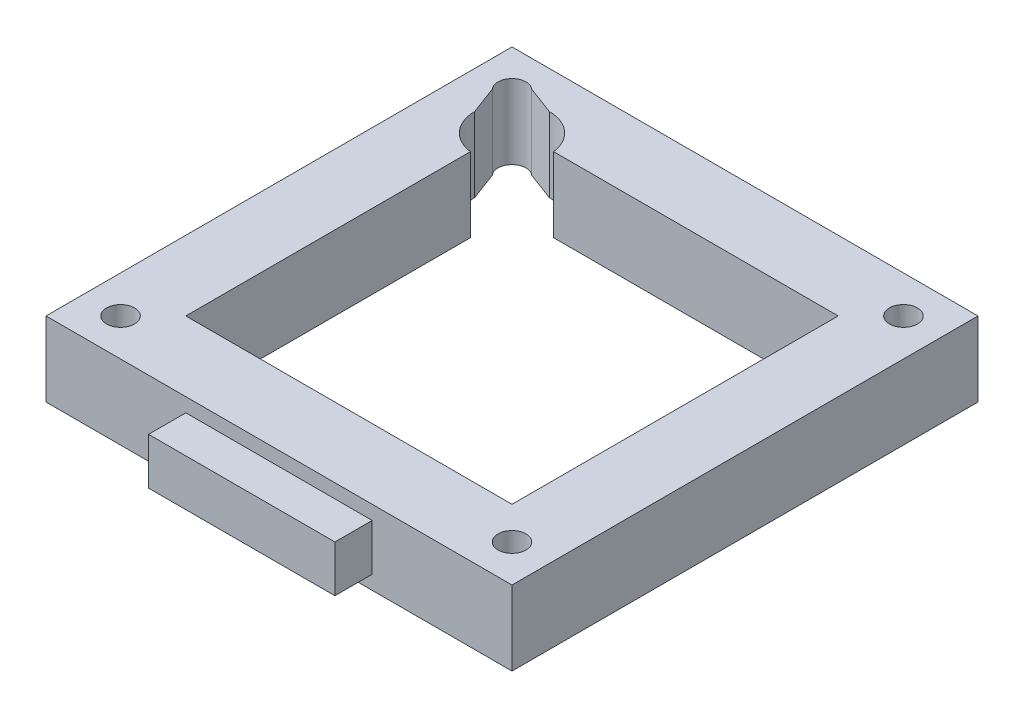
ISO-10303-21;
HEADER;
FILE_DESCRIPTION(('STEP AP214'),'2;1');
FILE_NAME('part.step','',(''),(''),'','','');
FILE_SCHEMA(('AUTOMOTIVE_DESIGN { 1 0 10303 214 1 1 1 1 }'));
ENDSEC;
DATA;
#1=APPLICATION_CONTEXT('core data for automotive mechanical design processes');
#2=APPLICATION_PROTOCOL_DEFINITION('international standard','automotive_design',2000,#1);
#3=PRODUCT_CONTEXT('',#1,'mechanical');
#4=PRODUCT('Part','Part','',(#3));
#5=PRODUCT_RELATED_PRODUCT_CATEGORY('part','',(#4));
#6=PRODUCT_DEFINITION_FORMATION('','',#4);
#7=PRODUCT_DEFINITION_CONTEXT('part definition',#1,'design');
#8=PRODUCT_DEFINITION('design','',#6,#7);
#9=PRODUCT_DEFINITION_SHAPE('','',#8);
#10=(LENGTH_UNIT() NAMED_UNIT(*) SI_UNIT(.MILLI.,.METRE.));
#11=(NAMED_UNIT(*) PLANE_ANGLE_UNIT() SI_UNIT($,.RADIAN.));
#12=(NAMED_UNIT(*) SI_UNIT($,.STERADIAN.) SOLID_ANGLE_UNIT());
#13=UNCERTAINTY_MEASURE_WITH_UNIT(LENGTH_MEASURE(1.E-05),#10,'distance_accuracy_value','');
#14=(GEOMETRIC_REPRESENTATION_CONTEXT(3) GLOBAL_UNCERTAINTY_ASSIGNED_CONTEXT((#13)) GLOBAL_UNIT_ASSIGNED_CONTEXT((#10,
#11,#12)) REPRESENTATION_CONTEXT('',''));
#15=CARTESIAN_POINT('',(0.,0.,0.));
#16=DIRECTION('',(0.,0.,1.));
#17=DIRECTION('',(1.,0.,0.));
#18=AXIS2_PLACEMENT_3D('',#15,#16,#17);
#19=CARTESIAN_POINT('',(0.,8.,25.));
#20=DIRECTION('',(0.,0.,-1.));
#21=DIRECTION('',(-1.,0.,0.));
#22=AXIS2_PLACEMENT_3D('',#19,#20,#21);
#23=PLANE('',#22);
#24=DIRECTION('',(1.,0.,0.));
#25=VECTOR('',#24,1.);
#26=CARTESIAN_POINT('',(0.,0.,25.));
#27=LINE('',#26,#25);
#28=CARTESIAN_POINT('',(-25.,0.,25.));
#29=VERTEX_POINT('',#28);
#30=CARTESIAN_POINT('',(25.,0.,25.));
#31=VERTEX_POINT('',#30);
#32=EDGE_CURVE('E452',#29,#31,#27,.T.);
#33=ORIENTED_EDGE('',*,*,#32,.T.);
#34=DIRECTION('',(0.,-1.,0.));
#35=VECTOR('',#34,1.);
#36=CARTESIAN_POINT('',(25.,8.,25.));
#37=LINE('',#36,#35);
#38=CARTESIAN_POINT('',(25.,8.,25.));
#39=VERTEX_POINT('',#38);
#40=EDGE_CURVE('E11',#39,#31,#37,.T.);
#41=ORIENTED_EDGE('',*,*,#40,.F.);
#42=DIRECTION('',(1.,0.,0.));
#43=VECTOR('',#42,1.);
#44=CARTESIAN_POINT('',(0.,8.,25.));
#45=LINE('',#44,#43);
#46=CARTESIAN_POINT('',(-25.,8.,25.));
#47=VERTEX_POINT('',#46);
#48=EDGE_CURVE('E392',#47,#39,#45,.T.);
#49=ORIENTED_EDGE('',*,*,#48,.F.);
#50=DIRECTION('',(0.,-1.,0.));
#51=VECTOR('',#50,1.);
#52=CARTESIAN_POINT('',(-25.,8.,25.));
#53=LINE('',#52,#51);
#54=EDGE_CURVE('E475',#47,#29,#53,.T.);
#55=ORIENTED_EDGE('',*,*,#54,.T.);
#56=EDGE_LOOP('',(#33,#41,#49,#55));
#57=FACE_BOUND('',#56,.T.);
#58=DIRECTION('',(1.,0.,0.));
#59=VECTOR('',#58,1.);
#60=CARTESIAN_POINT('',(0.,1.5000000000053,25.));
#61=LINE('',#60,#59);
#62=CARTESIAN_POINT('',(-10.0000000000553,1.5000000000053,25.));
#63=VERTEX_POINT('',#62);
#64=CARTESIAN_POINT('',(9.9999999999447,1.5000000000053,25.));
#65=VERTEX_POINT('',#64);
#66=EDGE_CURVE('E75',#63,#65,#61,.T.);
#67=ORIENTED_EDGE('',*,*,#66,.F.);
#68=DIRECTION('',(0.,-1.,0.));
#69=VECTOR('',#68,1.);
#70=CARTESIAN_POINT('',(-10.0000000000553,8.,25.));
#71=LINE('',#70,#69);
#72=CARTESIAN_POINT('',(-10.0000000000553,6.5000000000053,25.));
#73=VERTEX_POINT('',#72);
#74=EDGE_CURVE('E274',#73,#63,#71,.T.);
#75=ORIENTED_EDGE('',*,*,#74,.F.);
#76=DIRECTION('',(-1.,0.,0.));
#77=VECTOR('',#76,1.);
#78=CARTESIAN_POINT('',(0.,6.5000000000053,25.));
#79=LINE('',#78,#77);
#80=CARTESIAN_POINT('',(9.9999999999447,6.5000000000053,25.));
#81=VERTEX_POINT('',#80);
#82=EDGE_CURVE('E290',#81,#73,#79,.T.);
#83=ORIENTED_EDGE('',*,*,#82,.F.);
#84=DIRECTION('',(0.,1.,0.));
#85=VECTOR('',#84,1.);
#86=CARTESIAN_POINT('',(9.9999999999447,8.,25.));
#87=LINE('',#86,#85);
#88=EDGE_CURVE('E286',#65,#81,#87,.T.);
#89=ORIENTED_EDGE('',*,*,#88,.F.);
#90=EDGE_LOOP('',(#67,#75,#83,#89));
#91=FACE_BOUND('',#90,.T.);
#92=ADVANCED_FACE('F49',(#57,#91),#23,.F.);
#93=CARTESIAN_POINT('',(25.,8.,0.));
#94=DIRECTION('',(-1.,0.,0.));
#95=DIRECTION('',(0.,0.,1.));
#96=AXIS2_PLACEMENT_3D('',#93,#94,#95);
#97=PLANE('',#96);
#98=DIRECTION('',(0.,0.,-1.));
#99=VECTOR('',#98,1.);
#100=CARTESIAN_POINT('',(25.,0.,0.));
#101=LINE('',#100,#99);
#102=CARTESIAN_POINT('',(25.,0.,-25.));
#103=VERTEX_POINT('',#102);
#104=EDGE_CURVE('E456',#31,#103,#101,.T.);
#105=ORIENTED_EDGE('',*,*,#104,.T.);
#106=DIRECTION('',(0.,-1.,0.));
#107=VECTOR('',#106,1.);
#108=CARTESIAN_POINT('',(25.,8.,-25.));
#109=LINE('',#108,#107);
#110=CARTESIAN_POINT('',(25.,8.,-25.));
#111=VERTEX_POINT('',#110);
#112=EDGE_CURVE('E59',#111,#103,#109,.T.);
#113=ORIENTED_EDGE('',*,*,#112,.F.);
#114=DIRECTION('',(0.,0.,-1.));
#115=VECTOR('',#114,1.);
#116=CARTESIAN_POINT('',(25.,8.,0.));
#117=LINE('',#116,#115);
#118=EDGE_CURVE('E396',#39,#111,#117,.T.);
#119=ORIENTED_EDGE('',*,*,#118,.F.);
#120=ORIENTED_EDGE('',*,*,#40,.T.);
#121=EDGE_LOOP('',(#105,#113,#119,#120));
#122=FACE_BOUND('',#121,.T.);
#123=ADVANCED_FACE('F563',(#122),#97,.F.);
#124=CARTESIAN_POINT('',(0.,8.,-25.));
#125=DIRECTION('',(0.,0.,-1.));
#126=DIRECTION('',(-1.,0.,0.));
#127=AXIS2_PLACEMENT_3D('',#124,#125,#126);
#128=PLANE('',#127);
#129=DIRECTION('',(1.,0.,0.));
#130=VECTOR('',#129,1.);
#131=CARTESIAN_POINT('',(0.,6.5000000000053,-25.));
#132=LINE('',#131,#130);
#133=CARTESIAN_POINT('',(-10.0000000000553,6.5000000000053,-25.));
#134=VERTEX_POINT('',#133);
#135=CARTESIAN_POINT('',(9.9999999999447,6.5000000000053,-25.));
#136=VERTEX_POINT('',#135);
#137=EDGE_CURVE('E311',#134,#136,#132,.T.);
#138=ORIENTED_EDGE('',*,*,#137,.F.);
#139=DIRECTION('',(0.,1.,0.));
#140=VECTOR('',#139,1.);
#141=CARTESIAN_POINT('',(-10.0000000000553,8.,-25.));
#142=LINE('',#141,#140);
#143=CARTESIAN_POINT('',(-10.0000000000553,1.5000000000053,-25.));
#144=VERTEX_POINT('',#143);
#145=EDGE_CURVE('E317',#144,#134,#142,.T.);
#146=ORIENTED_EDGE('',*,*,#145,.F.);
#147=DIRECTION('',(-1.,0.,0.));
#148=VECTOR('',#147,1.);
#149=CARTESIAN_POINT('',(0.,1.5000000000053,-25.));
#150=LINE('',#149,#148);
#151=CARTESIAN_POINT('',(9.9999999999447,1.5000000000053,-25.));
#152=VERTEX_POINT('',#151);
#153=EDGE_CURVE('E336',#152,#144,#150,.T.);
#154=ORIENTED_EDGE('',*,*,#153,.F.);
#155=DIRECTION('',(0.,-1.,0.));
#156=VECTOR('',#155,1.);
#157=CARTESIAN_POINT('',(9.9999999999447,8.,-25.));
#158=LINE('',#157,#156);
#159=EDGE_CURVE('E332',#136,#152,#158,.T.);
#160=ORIENTED_EDGE('',*,*,#159,.F.);
#161=EDGE_LOOP('',(#138,#146,#154,#160));
#162=FACE_BOUND('',#161,.T.);
#163=DIRECTION('',(1.,0.,0.));
#164=VECTOR('',#163,1.);
#165=CARTESIAN_POINT('',(0.,0.,-25.));
#166=LINE('',#165,#164);
#167=CARTESIAN_POINT('',(-25.,0.,-25.));
#168=VERTEX_POINT('',#167);
#169=EDGE_CURVE('E460',#168,#103,#166,.T.);
#170=ORIENTED_EDGE('',*,*,#169,.F.);
#171=DIRECTION('',(0.,-1.,0.));
#172=VECTOR('',#171,1.);
#173=CARTESIAN_POINT('',(-25.,8.,-25.));
#174=LINE('',#173,#172);
#175=CARTESIAN_POINT('',(-25.,8.,-25.));
#176=VERTEX_POINT('',#175);
#177=EDGE_CURVE('E478',#176,#168,#174,.T.);
#178=ORIENTED_EDGE('',*,*,#177,.F.);
#179=DIRECTION('',(1.,0.,0.));
#180=VECTOR('',#179,1.);
#181=CARTESIAN_POINT('',(0.,8.,-25.));
#182=LINE('',#181,#180);
#183=EDGE_CURVE('E399',#176,#111,#182,.T.);
#184=ORIENTED_EDGE('',*,*,#183,.T.);
#185=ORIENTED_EDGE('',*,*,#112,.T.);
#186=EDGE_LOOP('',(#170,#178,#184,#185));
#187=FACE_BOUND('',#186,.T.);
#188=ADVANCED_FACE('F561',(#162,#187),#128,.T.);
#189=CARTESIAN_POINT('',(-17.,8.,-17.));
#190=DIRECTION('',(0.,-1.,0.));
#191=DIRECTION('',(0.,0.,-1.));
#192=AXIS2_PLACEMENT_3D('',#189,#190,#191);
#193=CYLINDRICAL_SURFACE('',#192,4.);
#194=CARTESIAN_POINT('',(-17.,0.,-17.));
#195=DIRECTION('',(0.,1.,0.));
#196=DIRECTION('',(0.,0.,1.));
#197=AXIS2_PLACEMENT_3D('',#194,#195,#196);
#198=CIRCLE('',#197,4.);
#199=CARTESIAN_POINT('',(-13.0313730334031,0.,-17.5));
#200=VERTEX_POINT('',#199);
#201=CARTESIAN_POINT('',(-17.,0.,-21.));
#202=VERTEX_POINT('',#201);
#203=EDGE_CURVE('E346',#200,#202,#198,.T.);
#204=ORIENTED_EDGE('',*,*,#203,.F.);
#205=DIRECTION('',(0.,-1.,0.));
#206=VECTOR('',#205,1.);
#207=CARTESIAN_POINT('',(-13.0313730334031,8.,-17.5));
#208=LINE('',#207,#206);
#209=CARTESIAN_POINT('',(-13.0313730334031,8.,-17.5));
#210=VERTEX_POINT('',#209);
#211=EDGE_CURVE('E53',#210,#200,#208,.T.);
#212=ORIENTED_EDGE('',*,*,#211,.F.);
#213=CARTESIAN_POINT('',(-17.,8.,-17.));
#214=DIRECTION('',(0.,1.,0.));
#215=DIRECTION('',(0.,0.,1.));
#216=AXIS2_PLACEMENT_3D('',#213,#214,#215);
#217=CIRCLE('',#216,4.);
#218=CARTESIAN_POINT('',(-17.,8.,-21.));
#219=VERTEX_POINT('',#218);
#220=EDGE_CURVE('E356',#210,#219,#217,.T.);
#221=ORIENTED_EDGE('',*,*,#220,.T.);
#222=DIRECTION('',(0.,-1.,0.));
#223=VECTOR('',#222,1.);
#224=CARTESIAN_POINT('',(-17.,8.,-21.));
#225=LINE('',#224,#223);
#226=EDGE_CURVE('E415',#219,#202,#225,.T.);
#227=ORIENTED_EDGE('',*,*,#226,.T.);
#228=EDGE_LOOP('',(#204,#212,#221,#227));
#229=FACE_BOUND('',#228,.T.);
#230=ADVANCED_FACE('F513',(#229),#193,.F.);
#231=CARTESIAN_POINT('',(0.,8.,-17.5));
#232=DIRECTION('',(0.,0.,1.));
#233=DIRECTION('',(1.,0.,0.));
#234=AXIS2_PLACEMENT_3D('',#231,#232,#233);
#235=PLANE('',#234);
#236=DIRECTION('',(-1.,0.,0.));
#237=VECTOR('',#236,1.);
#238=CARTESIAN_POINT('',(0.,0.,-17.5));
#239=LINE('',#238,#237);
#240=CARTESIAN_POINT('',(17.5,0.,-17.5));
#241=VERTEX_POINT('',#240);
#242=EDGE_CURVE('E419',#241,#200,#239,.T.);
#243=ORIENTED_EDGE('',*,*,#242,.F.);
#244=DIRECTION('',(0.,-1.,0.));
#245=VECTOR('',#244,1.);
#246=CARTESIAN_POINT('',(17.5,8.,-17.5));
#247=LINE('',#246,#245);
#248=CARTESIAN_POINT('',(17.5,8.,-17.5));
#249=VERTEX_POINT('',#248);
#250=EDGE_CURVE('E502',#249,#241,#247,.T.);
#251=ORIENTED_EDGE('',*,*,#250,.F.);
#252=DIRECTION('',(-1.,0.,0.));
#253=VECTOR('',#252,1.);
#254=CARTESIAN_POINT('',(0.,8.,-17.5));
#255=LINE('',#254,#253);
#256=EDGE_CURVE('E360',#249,#210,#255,.T.);
#257=ORIENTED_EDGE('',*,*,#256,.T.);
#258=ORIENTED_EDGE('',*,*,#211,.T.);
#259=EDGE_LOOP('',(#243,#251,#257,#258));
#260=FACE_BOUND('',#259,.T.);
#261=ADVANCED_FACE('F51',(#260),#235,.T.);
#262=CARTESIAN_POINT('',(17.5,8.,0.));
#263=DIRECTION('',(-1.,0.,0.));
#264=DIRECTION('',(0.,0.,1.));
#265=AXIS2_PLACEMENT_3D('',#262,#263,#264);
#266=PLANE('',#265);
#267=DIRECTION('',(0.,0.,-1.));
#268=VECTOR('',#267,1.);
#269=CARTESIAN_POINT('',(17.5,0.,0.));
#270=LINE('',#269,#268);
#271=CARTESIAN_POINT('',(17.5,0.,17.5));
#272=VERTEX_POINT('',#271);
#273=EDGE_CURVE('E424',#272,#241,#270,.T.);
#274=ORIENTED_EDGE('',*,*,#273,.F.);
#275=DIRECTION('',(0.,-1.,0.));
#276=VECTOR('',#275,1.);
#277=CARTESIAN_POINT('',(17.5,8.,17.5));
#278=LINE('',#277,#276);
#279=CARTESIAN_POINT('',(17.5,8.,17.5));
#280=VERTEX_POINT('',#279);
#281=EDGE_CURVE('E500',#280,#272,#278,.T.);
#282=ORIENTED_EDGE('',*,*,#281,.F.);
#283=DIRECTION('',(0.,0.,-1.));
#284=VECTOR('',#283,1.);
#285=CARTESIAN_POINT('',(17.5,8.,0.));
#286=LINE('',#285,#284);
#287=EDGE_CURVE('E366',#280,#249,#286,.T.);
#288=ORIENTED_EDGE('',*,*,#287,.T.);
#289=ORIENTED_EDGE('',*,*,#250,.T.);
#290=EDGE_LOOP('',(#274,#282,#288,#289));
#291=FACE_BOUND('',#290,.T.);
#292=ADVANCED_FACE('F521',(#291),#266,.T.);
#293=CARTESIAN_POINT('',(0.,8.,17.5));
#294=DIRECTION('',(0.,0.,-1.));
#295=DIRECTION('',(-1.,0.,0.));
#296=AXIS2_PLACEMENT_3D('',#293,#294,#295);
#297=PLANE('',#296);
#298=DIRECTION('',(1.,0.,0.));
#299=VECTOR('',#298,1.);
#300=CARTESIAN_POINT('',(0.,0.,17.5));
#301=LINE('',#300,#299);
#302=CARTESIAN_POINT('',(-17.5,0.,17.5));
#303=VERTEX_POINT('',#302);
#304=EDGE_CURVE('E428',#303,#272,#301,.T.);
#305=ORIENTED_EDGE('',*,*,#304,.F.);
#306=DIRECTION('',(0.,-1.,0.));
#307=VECTOR('',#306,1.);
#308=CARTESIAN_POINT('',(-17.5,8.,17.5));
#309=LINE('',#308,#307);
#310=CARTESIAN_POINT('',(-17.5,8.,17.5));
#311=VERTEX_POINT('',#310);
#312=EDGE_CURVE('E497',#311,#303,#309,.T.);
#313=ORIENTED_EDGE('',*,*,#312,.F.);
#314=DIRECTION('',(1.,0.,0.));
#315=VECTOR('',#314,1.);
#316=CARTESIAN_POINT('',(0.,8.,17.5));
#317=LINE('',#316,#315);
#318=EDGE_CURVE('E370',#311,#280,#317,.T.);
#319=ORIENTED_EDGE('',*,*,#318,.T.);
#320=ORIENTED_EDGE('',*,*,#281,.T.);
#321=EDGE_LOOP('',(#305,#313,#319,#320));
#322=FACE_BOUND('',#321,.T.);
#323=ADVANCED_FACE('F528',(#322),#297,.T.);
#324=CARTESIAN_POINT('',(-17.5,8.,0.));
#325=DIRECTION('',(-1.,0.,0.));
#326=DIRECTION('',(0.,0.,1.));
#327=AXIS2_PLACEMENT_3D('',#324,#325,#326);
#328=PLANE('',#327);
#329=DIRECTION('',(0.,0.,-1.));
#330=VECTOR('',#329,1.);
#331=CARTESIAN_POINT('',(-17.5,0.,0.));
#332=LINE('',#331,#330);
#333=CARTESIAN_POINT('',(-17.5,0.,-13.0313730334031));
#334=VERTEX_POINT('',#333);
#335=EDGE_CURVE('E432',#303,#334,#332,.T.);
#336=ORIENTED_EDGE('',*,*,#335,.T.);
#337=DIRECTION('',(0.,-1.,0.));
#338=VECTOR('',#337,1.);
#339=CARTESIAN_POINT('',(-17.5,8.,-13.0313730334031));
#340=LINE('',#339,#338);
#341=CARTESIAN_POINT('',(-17.5,8.,-13.0313730334031));
#342=VERTEX_POINT('',#341);
#343=EDGE_CURVE('E494',#342,#334,#340,.T.);
#344=ORIENTED_EDGE('',*,*,#343,.F.);
#345=DIRECTION('',(0.,0.,-1.));
#346=VECTOR('',#345,1.);
#347=CARTESIAN_POINT('',(-17.5,8.,0.));
#348=LINE('',#347,#346);
#349=EDGE_CURVE('E374',#311,#342,#348,.T.);
#350=ORIENTED_EDGE('',*,*,#349,.F.);
#351=ORIENTED_EDGE('',*,*,#312,.T.);
#352=EDGE_LOOP('',(#336,#344,#350,#351));
#353=FACE_BOUND('',#352,.T.);
#354=ADVANCED_FACE('F532',(#353),#328,.F.);
#355=CARTESIAN_POINT('',(-21.,0.,-17.));
#356=VERTEX_POINT('',#355);
#357=EDGE_CURVE('E420',#356,#334,#198,.T.);
#358=ORIENTED_EDGE('',*,*,#357,.F.);
#359=DIRECTION('',(0.,-1.,0.));
#360=VECTOR('',#359,1.);
#361=CARTESIAN_POINT('',(-21.,8.,-17.));
#362=LINE('',#361,#360);
#363=CARTESIAN_POINT('',(-21.,8.,-17.));
#364=VERTEX_POINT('',#363);
#365=EDGE_CURVE('E491',#364,#356,#362,.T.);
#366=ORIENTED_EDGE('',*,*,#365,.F.);
#367=EDGE_CURVE('E362',#364,#342,#217,.T.);
#368=ORIENTED_EDGE('',*,*,#367,.T.);
#369=ORIENTED_EDGE('',*,*,#343,.T.);
#370=EDGE_LOOP('',(#358,#366,#368,#369));
#371=FACE_BOUND('',#370,.T.);
#372=ADVANCED_FACE('F551',(#371),#193,.F.);
#373=CARTESIAN_POINT('',(-12.8219178082192,8.,4.80821917808219));
#374=DIRECTION('',(0.936329177569045,0.,-0.351123441588392));
#375=DIRECTION('',(-0.351123441588392,0.,-0.936329177569045));
#376=AXIS2_PLACEMENT_3D('',#373,#374,#375);
#377=PLANE('',#376);
#378=DIRECTION('',(0.351123441588392,0.,0.936329177569044));
#379=VECTOR('',#378,1.);
#380=CARTESIAN_POINT('',(-12.8219178082192,0.,4.80821917808219));
#381=LINE('',#380,#379);
#382=CARTESIAN_POINT('',(-22.1301369863014,0.,-20.013698630137));
#383=VERTEX_POINT('',#382);
#384=EDGE_CURVE('E436',#383,#356,#381,.T.);
#385=ORIENTED_EDGE('',*,*,#384,.F.);
#386=DIRECTION('',(0.,-1.,0.));
#387=VECTOR('',#386,1.);
#388=CARTESIAN_POINT('',(-22.1301369863014,8.,-20.013698630137));
#389=LINE('',#388,#387);
#390=CARTESIAN_POINT('',(-22.1301369863014,8.,-20.013698630137));
#391=VERTEX_POINT('',#390);
#392=EDGE_CURVE('E488',#391,#383,#389,.T.);
#393=ORIENTED_EDGE('',*,*,#392,.F.);
#394=DIRECTION('',(0.351123441588392,0.,0.936329177569044));
#395=VECTOR('',#394,1.);
#396=CARTESIAN_POINT('',(-12.8219178082192,8.,4.80821917808219));
#397=LINE('',#396,#395);
#398=EDGE_CURVE('E377',#391,#364,#397,.T.);
#399=ORIENTED_EDGE('',*,*,#398,.T.);
#400=ORIENTED_EDGE('',*,*,#365,.T.);
#401=EDGE_LOOP('',(#385,#393,#399,#400));
#402=FACE_BOUND('',#401,.T.);
#403=ADVANCED_FACE('F541',(#402),#377,.T.);
#404=CARTESIAN_POINT('',(-21.,8.,-21.));
#405=DIRECTION('',(0.,-1.,0.));
#406=DIRECTION('',(0.,0.,-1.));
#407=AXIS2_PLACEMENT_3D('',#404,#405,#406);
#408=CYLINDRICAL_SURFACE('',#407,1.5);
#409=CARTESIAN_POINT('',(-21.,0.,-21.));
#410=DIRECTION('',(0.,1.,0.));
#411=DIRECTION('',(0.,0.,1.));
#412=AXIS2_PLACEMENT_3D('',#409,#410,#411);
#413=CIRCLE('',#412,1.5);
#414=CARTESIAN_POINT('',(-20.013698630137,0.,-22.1301369863014));
#415=VERTEX_POINT('',#414);
#416=EDGE_CURVE('E440',#415,#383,#413,.T.);
#417=ORIENTED_EDGE('',*,*,#416,.F.);
#418=DIRECTION('',(0.,-1.,0.));
#419=VECTOR('',#418,1.);
#420=CARTESIAN_POINT('',(-20.013698630137,8.,-22.1301369863014));
#421=LINE('',#420,#419);
#422=CARTESIAN_POINT('',(-20.013698630137,8.,-22.1301369863014));
#423=VERTEX_POINT('',#422);
#424=EDGE_CURVE('E485',#423,#415,#421,.T.);
#425=ORIENTED_EDGE('',*,*,#424,.F.);
#426=CARTESIAN_POINT('',(-21.,8.,-21.));
#427=DIRECTION('',(0.,1.,0.));
#428=DIRECTION('',(0.,0.,1.));
#429=AXIS2_PLACEMENT_3D('',#426,#427,#428);
#430=CIRCLE('',#429,1.5);
#431=EDGE_CURVE('E381',#423,#391,#430,.T.);
#432=ORIENTED_EDGE('',*,*,#431,.T.);
#433=ORIENTED_EDGE('',*,*,#392,.T.);
#434=EDGE_LOOP('',(#417,#425,#432,#433));
#435=FACE_BOUND('',#434,.T.);
#436=ADVANCED_FACE('F545',(#435),#408,.F.);
#437=CARTESIAN_POINT('',(21.,8.,21.));
#438=DIRECTION('',(0.,-1.,0.));
#439=DIRECTION('',(0.,0.,-1.));
#440=AXIS2_PLACEMENT_3D('',#437,#438,#439);
#441=CYLINDRICAL_SURFACE('',#440,1.5);
#442=CARTESIAN_POINT('',(21.,8.,21.));
#443=DIRECTION('',(0.,1.,0.));
#444=DIRECTION('',(0.,0.,1.));
#445=AXIS2_PLACEMENT_3D('',#442,#443,#444);
#446=CIRCLE('',#445,1.5);
#447=CARTESIAN_POINT('',(21.,8.,22.5));
#448=VERTEX_POINT('',#447);
#449=EDGE_CURVE('E407',#448,#448,#446,.T.);
#450=ORIENTED_EDGE('',*,*,#449,.T.);
#451=EDGE_LOOP('',(#450));
#452=FACE_BOUND('',#451,.T.);
#453=CARTESIAN_POINT('',(21.,0.,21.));
#454=DIRECTION('',(0.,1.,0.));
#455=DIRECTION('',(0.,0.,1.));
#456=AXIS2_PLACEMENT_3D('',#453,#454,#455);
#457=CIRCLE('',#456,1.5);
#458=CARTESIAN_POINT('',(21.,0.,22.5));
#459=VERTEX_POINT('',#458);
#460=EDGE_CURVE('E468',#459,#459,#457,.T.);
#461=ORIENTED_EDGE('',*,*,#460,.F.);
#462=EDGE_LOOP('',(#461));
#463=FACE_BOUND('',#462,.T.);
#464=ADVANCED_FACE('F584',(#452,#463),#441,.F.);
#465=CARTESIAN_POINT('',(-25.,8.,0.));
#466=DIRECTION('',(-1.,0.,0.));
#467=DIRECTION('',(0.,0.,1.));
#468=AXIS2_PLACEMENT_3D('',#465,#466,#467);
#469=PLANE('',#468);
#470=DIRECTION('',(0.,0.,-1.));
#471=VECTOR('',#470,1.);
#472=CARTESIAN_POINT('',(-25.,6.5,0.));
#473=LINE('',#472,#471);
#474=CARTESIAN_POINT('',(-25.,6.5,10.));
#475=VERTEX_POINT('',#474);
#476=CARTESIAN_POINT('',(-25.,6.5,-10.));
#477=VERTEX_POINT('',#476);
#478=EDGE_CURVE('E67',#475,#477,#473,.T.);
#479=ORIENTED_EDGE('',*,*,#478,.F.);
#480=DIRECTION('',(0.,1.,0.));
#481=VECTOR('',#480,1.);
#482=CARTESIAN_POINT('',(-25.,8.,10.));
#483=LINE('',#482,#481);
#484=CARTESIAN_POINT('',(-25.,1.5,10.));
#485=VERTEX_POINT('',#484);
#486=EDGE_CURVE('E242',#485,#475,#483,.T.);
#487=ORIENTED_EDGE('',*,*,#486,.F.);
#488=DIRECTION('',(0.,0.,1.));
#489=VECTOR('',#488,1.);
#490=CARTESIAN_POINT('',(-25.,1.50000000000004,0.));
#491=LINE('',#490,#489);
#492=CARTESIAN_POINT('',(-25.,1.50000000000007,-10.));
#493=VERTEX_POINT('',#492);
#494=EDGE_CURVE('E246',#493,#485,#491,.T.);
#495=ORIENTED_EDGE('',*,*,#494,.F.);
#496=DIRECTION('',(0.,-1.,0.));
#497=VECTOR('',#496,1.);
#498=CARTESIAN_POINT('',(-25.,8.,-10.));
#499=LINE('',#498,#497);
#500=EDGE_CURVE('E255',#477,#493,#499,.T.);
#501=ORIENTED_EDGE('',*,*,#500,.F.);
#502=EDGE_LOOP('',(#479,#487,#495,#501));
#503=FACE_BOUND('',#502,.T.);
#504=DIRECTION('',(0.,0.,-1.));
#505=VECTOR('',#504,1.);
#506=CARTESIAN_POINT('',(-25.,0.,0.));
#507=LINE('',#506,#505);
#508=EDGE_CURVE('E464',#29,#168,#507,.T.);
#509=ORIENTED_EDGE('',*,*,#508,.F.);
#510=ORIENTED_EDGE('',*,*,#54,.F.);
#511=DIRECTION('',(0.,0.,-1.));
#512=VECTOR('',#511,1.);
#513=CARTESIAN_POINT('',(-25.,8.,0.));
#514=LINE('',#513,#512);
#515=EDGE_CURVE('E403',#47,#176,#514,.T.);
#516=ORIENTED_EDGE('',*,*,#515,.T.);
#517=ORIENTED_EDGE('',*,*,#177,.T.);
#518=EDGE_LOOP('',(#509,#510,#516,#517));
#519=FACE_BOUND('',#518,.T.);
#520=ADVANCED_FACE('F578',(#503,#519),#469,.T.);
#521=CARTESIAN_POINT('',(21.,8.,-21.));
#522=DIRECTION('',(0.,-1.,0.));
#523=DIRECTION('',(0.,0.,-1.));
#524=AXIS2_PLACEMENT_3D('',#521,#522,#523);
#525=CYLINDRICAL_SURFACE('',#524,1.5);
#526=CARTESIAN_POINT('',(21.,8.,-21.));
#527=DIRECTION('',(0.,1.,0.));
#528=DIRECTION('',(0.,0.,1.));
#529=AXIS2_PLACEMENT_3D('',#526,#527,#528);
#530=CIRCLE('',#529,1.5);
#531=CARTESIAN_POINT('',(21.,8.,-19.5));
#532=VERTEX_POINT('',#531);
#533=EDGE_CURVE('E388',#532,#532,#530,.F.);
#534=ORIENTED_EDGE('',*,*,#533,.F.);
#535=EDGE_LOOP('',(#534));
#536=FACE_BOUND('',#535,.T.);
#537=CARTESIAN_POINT('',(21.,0.,-21.));
#538=DIRECTION('',(0.,1.,0.));
#539=DIRECTION('',(0.,0.,1.));
#540=AXIS2_PLACEMENT_3D('',#537,#538,#539);
#541=CIRCLE('',#540,1.5);
#542=CARTESIAN_POINT('',(21.,0.,-19.5));
#543=VERTEX_POINT('',#542);
#544=EDGE_CURVE('E448',#543,#543,#541,.F.);
#545=ORIENTED_EDGE('',*,*,#544,.T.);
#546=EDGE_LOOP('',(#545));
#547=FACE_BOUND('',#546,.T.);
#548=ADVANCED_FACE('F575',(#536,#547),#525,.F.);
#549=CARTESIAN_POINT('',(4.80821917808219,8.,-12.8219178082192));
#550=DIRECTION('',(0.351123441588392,0.,-0.936329177569045));
#551=DIRECTION('',(-0.936329177569045,0.,-0.351123441588392));
#552=AXIS2_PLACEMENT_3D('',#549,#550,#551);
#553=PLANE('',#552);
#554=DIRECTION('',(0.936329177569044,0.,0.351123441588392));
#555=VECTOR('',#554,1.);
#556=CARTESIAN_POINT('',(4.80821917808219,0.,-12.8219178082192));
#557=LINE('',#556,#555);
#558=EDGE_CURVE('E444',#415,#202,#557,.T.);
#559=ORIENTED_EDGE('',*,*,#558,.T.);
#560=ORIENTED_EDGE('',*,*,#226,.F.);
#561=DIRECTION('',(0.936329177569044,0.,0.351123441588392));
#562=VECTOR('',#561,1.);
#563=CARTESIAN_POINT('',(4.80821917808219,8.,-12.8219178082192));
#564=LINE('',#563,#562);
#565=EDGE_CURVE('E385',#423,#219,#564,.T.);
#566=ORIENTED_EDGE('',*,*,#565,.F.);
#567=ORIENTED_EDGE('',*,*,#424,.T.);
#568=EDGE_LOOP('',(#559,#560,#566,#567));
#569=FACE_BOUND('',#568,.T.);
#570=ADVANCED_FACE('F548',(#569),#553,.F.);
#571=CARTESIAN_POINT('',(-21.,8.,21.));
#572=DIRECTION('',(0.,-1.,0.));
#573=DIRECTION('',(0.,0.,-1.));
#574=AXIS2_PLACEMENT_3D('',#571,#572,#573);
#575=CYLINDRICAL_SURFACE('',#574,1.5);
#576=CARTESIAN_POINT('',(-21.,8.,21.));
#577=DIRECTION('',(0.,1.,0.));
#578=DIRECTION('',(0.,0.,1.));
#579=AXIS2_PLACEMENT_3D('',#576,#577,#578);
#580=CIRCLE('',#579,1.5);
#581=CARTESIAN_POINT('',(-21.,8.,22.5));
#582=VERTEX_POINT('',#581);
#583=EDGE_CURVE('E411',#582,#582,#580,.F.);
#584=ORIENTED_EDGE('',*,*,#583,.F.);
#585=EDGE_LOOP('',(#584));
#586=FACE_BOUND('',#585,.T.);
#587=CARTESIAN_POINT('',(-21.,0.,21.));
#588=DIRECTION('',(0.,1.,0.));
#589=DIRECTION('',(0.,0.,1.));
#590=AXIS2_PLACEMENT_3D('',#587,#588,#589);
#591=CIRCLE('',#590,1.5);
#592=CARTESIAN_POINT('',(-21.,0.,22.5));
#593=VERTEX_POINT('',#592);
#594=EDGE_CURVE('E361',#593,#593,#591,.F.);
#595=ORIENTED_EDGE('',*,*,#594,.T.);
#596=EDGE_LOOP('',(#595));
#597=FACE_BOUND('',#596,.T.);
#598=ADVANCED_FACE('F582',(#586,#597),#575,.F.);
#599=CARTESIAN_POINT('',(0.,8.,0.));
#600=DIRECTION('',(0.,1.,0.));
#601=DIRECTION('',(0.,0.,1.));
#602=AXIS2_PLACEMENT_3D('',#599,#600,#601);
#603=PLANE('',#602);
#604=ORIENTED_EDGE('',*,*,#220,.F.);
#605=ORIENTED_EDGE('',*,*,#256,.F.);
#606=ORIENTED_EDGE('',*,*,#287,.F.);
#607=ORIENTED_EDGE('',*,*,#318,.F.);
#608=ORIENTED_EDGE('',*,*,#349,.T.);
#609=ORIENTED_EDGE('',*,*,#367,.F.);
#610=ORIENTED_EDGE('',*,*,#398,.F.);
#611=ORIENTED_EDGE('',*,*,#431,.F.);
#612=ORIENTED_EDGE('',*,*,#565,.T.);
#613=EDGE_LOOP('',(#604,#605,#606,#607,#608,#609,#610,#611,#612));
#614=FACE_BOUND('',#613,.T.);
#615=ORIENTED_EDGE('',*,*,#533,.T.);
#616=EDGE_LOOP('',(#615));
#617=FACE_BOUND('',#616,.T.);
#618=ORIENTED_EDGE('',*,*,#48,.T.);
#619=ORIENTED_EDGE('',*,*,#118,.T.);
#620=ORIENTED_EDGE('',*,*,#183,.F.);
#621=ORIENTED_EDGE('',*,*,#515,.F.);
#622=EDGE_LOOP('',(#618,#619,#620,#621));
#623=FACE_BOUND('',#622,.T.);
#624=ORIENTED_EDGE('',*,*,#449,.F.);
#625=EDGE_LOOP('',(#624));
#626=FACE_BOUND('',#625,.T.);
#627=ORIENTED_EDGE('',*,*,#583,.T.);
#628=EDGE_LOOP('',(#627));
#629=FACE_BOUND('',#628,.T.);
#630=ADVANCED_FACE('F526',(#614,#617,#623,#626,#629),#603,.T.);
#631=CARTESIAN_POINT('',(0.,0.,0.));
#632=DIRECTION('',(0.,1.,0.));
#633=DIRECTION('',(0.,0.,1.));
#634=AXIS2_PLACEMENT_3D('',#631,#632,#633);
#635=PLANE('',#634);
#636=ORIENTED_EDGE('',*,*,#203,.T.);
#637=ORIENTED_EDGE('',*,*,#558,.F.);
#638=ORIENTED_EDGE('',*,*,#416,.T.);
#639=ORIENTED_EDGE('',*,*,#384,.T.);
#640=ORIENTED_EDGE('',*,*,#357,.T.);
#641=ORIENTED_EDGE('',*,*,#335,.F.);
#642=ORIENTED_EDGE('',*,*,#304,.T.);
#643=ORIENTED_EDGE('',*,*,#273,.T.);
#644=ORIENTED_EDGE('',*,*,#242,.T.);
#645=EDGE_LOOP('',(#636,#637,#638,#639,#640,#641,#642,#643,#644));
#646=FACE_BOUND('',#645,.T.);
#647=ORIENTED_EDGE('',*,*,#544,.F.);
#648=EDGE_LOOP('',(#647));
#649=FACE_BOUND('',#648,.T.);
#650=ORIENTED_EDGE('',*,*,#32,.F.);
#651=ORIENTED_EDGE('',*,*,#508,.T.);
#652=ORIENTED_EDGE('',*,*,#169,.T.);
#653=ORIENTED_EDGE('',*,*,#104,.F.);
#654=EDGE_LOOP('',(#650,#651,#652,#653));
#655=FACE_BOUND('',#654,.T.);
#656=ORIENTED_EDGE('',*,*,#460,.T.);
#657=EDGE_LOOP('',(#656));
#658=FACE_BOUND('',#657,.T.);
#659=ORIENTED_EDGE('',*,*,#594,.F.);
#660=EDGE_LOOP('',(#659));
#661=FACE_BOUND('',#660,.T.);
#662=ADVANCED_FACE('F517',(#646,#649,#655,#658,#661),#635,.F.);
#663=CARTESIAN_POINT('',(0.,6.5000000000053,-21.));
#664=DIRECTION('',(0.,1.,0.));
#665=DIRECTION('',(0.,0.,1.));
#666=AXIS2_PLACEMENT_3D('',#663,#664,#665);
#667=PLANE('',#666);
#668=ORIENTED_EDGE('',*,*,#137,.T.);
#669=DIRECTION('',(0.,0.,-1.));
#670=VECTOR('',#669,1.);
#671=CARTESIAN_POINT('',(9.9999999999447,6.5000000000053,-21.));
#672=LINE('',#671,#670);
#673=CARTESIAN_POINT('',(9.9999999999447,6.5000000000053,-21.));
#674=VERTEX_POINT('',#673);
#675=EDGE_CURVE('E329',#674,#136,#672,.T.);
#676=ORIENTED_EDGE('',*,*,#675,.F.);
#677=DIRECTION('',(1.,0.,0.));
#678=VECTOR('',#677,1.);
#679=CARTESIAN_POINT('',(0.,6.5000000000053,-21.));
#680=LINE('',#679,#678);
#681=CARTESIAN_POINT('',(-10.0000000000553,6.5000000000053,-21.));
#682=VERTEX_POINT('',#681);
#683=EDGE_CURVE('E312',#682,#674,#680,.T.);
#684=ORIENTED_EDGE('',*,*,#683,.F.);
#685=DIRECTION('',(0.,0.,-1.));
#686=VECTOR('',#685,1.);
#687=CARTESIAN_POINT('',(-10.0000000000553,6.5000000000053,-21.));
#688=LINE('',#687,#686);
#689=EDGE_CURVE('E343',#682,#134,#688,.T.);
#690=ORIENTED_EDGE('',*,*,#689,.T.);
#691=EDGE_LOOP('',(#668,#676,#684,#690));
#692=FACE_BOUND('',#691,.T.);
#693=ADVANCED_FACE('F633',(#692),#667,.F.);
#694=CARTESIAN_POINT('',(-10.0000000000553,8.,-21.));
#695=DIRECTION('',(-1.,0.,0.));
#696=DIRECTION('',(0.,0.,1.));
#697=AXIS2_PLACEMENT_3D('',#694,#695,#696);
#698=PLANE('',#697);
#699=ORIENTED_EDGE('',*,*,#145,.T.);
#700=ORIENTED_EDGE('',*,*,#689,.F.);
#701=DIRECTION('',(0.,1.,0.));
#702=VECTOR('',#701,1.);
#703=CARTESIAN_POINT('',(-10.0000000000553,8.,-21.));
#704=LINE('',#703,#702);
#705=CARTESIAN_POINT('',(-10.0000000000553,1.5000000000053,-21.));
#706=VERTEX_POINT('',#705);
#707=EDGE_CURVE('E325',#706,#682,#704,.T.);
#708=ORIENTED_EDGE('',*,*,#707,.F.);
#709=DIRECTION('',(0.,0.,-1.));
#710=VECTOR('',#709,1.);
#711=CARTESIAN_POINT('',(-10.0000000000553,1.5000000000053,-21.));
#712=LINE('',#711,#710);
#713=EDGE_CURVE('E347',#706,#144,#712,.T.);
#714=ORIENTED_EDGE('',*,*,#713,.T.);
#715=EDGE_LOOP('',(#699,#700,#708,#714));
#716=FACE_BOUND('',#715,.T.);
#717=ADVANCED_FACE('F638',(#716),#698,.F.);
#718=CARTESIAN_POINT('',(0.,1.5000000000053,-21.));
#719=DIRECTION('',(0.,-1.,0.));
#720=DIRECTION('',(0.,0.,-1.));
#721=AXIS2_PLACEMENT_3D('',#718,#719,#720);
#722=PLANE('',#721);
#723=ORIENTED_EDGE('',*,*,#153,.T.);
#724=ORIENTED_EDGE('',*,*,#713,.F.);
#725=DIRECTION('',(-1.,0.,0.));
#726=VECTOR('',#725,1.);
#727=CARTESIAN_POINT('',(0.,1.5000000000053,-21.));
#728=LINE('',#727,#726);
#729=CARTESIAN_POINT('',(9.9999999999447,1.5000000000053,-21.));
#730=VERTEX_POINT('',#729);
#731=EDGE_CURVE('E321',#730,#706,#728,.T.);
#732=ORIENTED_EDGE('',*,*,#731,.F.);
#733=DIRECTION('',(0.,0.,-1.));
#734=VECTOR('',#733,1.);
#735=CARTESIAN_POINT('',(9.9999999999447,1.5000000000053,-21.));
#736=LINE('',#735,#734);
#737=EDGE_CURVE('E350',#730,#152,#736,.T.);
#738=ORIENTED_EDGE('',*,*,#737,.T.);
#739=EDGE_LOOP('',(#723,#724,#732,#738));
#740=FACE_BOUND('',#739,.T.);
#741=ADVANCED_FACE('F646',(#740),#722,.F.);
#742=CARTESIAN_POINT('',(9.9999999999447,8.,-21.));
#743=DIRECTION('',(1.,0.,0.));
#744=DIRECTION('',(0.,0.,-1.));
#745=AXIS2_PLACEMENT_3D('',#742,#743,#744);
#746=PLANE('',#745);
#747=ORIENTED_EDGE('',*,*,#159,.T.);
#748=ORIENTED_EDGE('',*,*,#737,.F.);
#749=DIRECTION('',(0.,-1.,0.));
#750=VECTOR('',#749,1.);
#751=CARTESIAN_POINT('',(9.9999999999447,8.,-21.));
#752=LINE('',#751,#750);
#753=EDGE_CURVE('E316',#674,#730,#752,.T.);
#754=ORIENTED_EDGE('',*,*,#753,.F.);
#755=ORIENTED_EDGE('',*,*,#675,.T.);
#756=EDGE_LOOP('',(#747,#748,#754,#755));
#757=FACE_BOUND('',#756,.T.);
#758=ADVANCED_FACE('F642',(#757),#746,.F.);
#759=CARTESIAN_POINT('',(0.,0.,-21.));
#760=DIRECTION('',(0.,0.,-1.));
#761=DIRECTION('',(-1.,0.,0.));
#762=AXIS2_PLACEMENT_3D('',#759,#760,#761);
#763=PLANE('',#762);
#764=ORIENTED_EDGE('',*,*,#683,.T.);
#765=ORIENTED_EDGE('',*,*,#753,.T.);
#766=ORIENTED_EDGE('',*,*,#731,.T.);
#767=ORIENTED_EDGE('',*,*,#707,.T.);
#768=EDGE_LOOP('',(#764,#765,#766,#767));
#769=FACE_BOUND('',#768,.T.);
#770=ADVANCED_FACE('F645',(#769),#763,.T.);
#771=CARTESIAN_POINT('',(0.,1.5000000000053,29.));
#772=DIRECTION('',(0.,1.,0.));
#773=DIRECTION('',(0.,0.,1.));
#774=AXIS2_PLACEMENT_3D('',#771,#772,#773);
#775=PLANE('',#774);
#776=ORIENTED_EDGE('',*,*,#66,.T.);
#777=DIRECTION('',(0.,0.,-1.));
#778=VECTOR('',#777,1.);
#779=CARTESIAN_POINT('',(9.9999999999447,1.5000000000053,29.));
#780=LINE('',#779,#778);
#781=CARTESIAN_POINT('',(9.9999999999447,1.5000000000053,29.));
#782=VERTEX_POINT('',#781);
#783=EDGE_CURVE('E307',#782,#65,#780,.T.);
#784=ORIENTED_EDGE('',*,*,#783,.F.);
#785=DIRECTION('',(1.,0.,0.));
#786=VECTOR('',#785,1.);
#787=CARTESIAN_POINT('',(0.,1.5000000000053,29.));
#788=LINE('',#787,#786);
#789=CARTESIAN_POINT('',(-10.0000000000553,1.5000000000053,29.));
#790=VERTEX_POINT('',#789);
#791=EDGE_CURVE('E269',#790,#782,#788,.T.);
#792=ORIENTED_EDGE('',*,*,#791,.F.);
#793=DIRECTION('',(0.,0.,-1.));
#794=VECTOR('',#793,1.);
#795=CARTESIAN_POINT('',(-10.0000000000553,1.5000000000053,29.));
#796=LINE('',#795,#794);
#797=EDGE_CURVE('E283',#790,#63,#796,.T.);
#798=ORIENTED_EDGE('',*,*,#797,.T.);
#799=EDGE_LOOP('',(#776,#784,#792,#798));
#800=FACE_BOUND('',#799,.T.);
#801=ADVANCED_FACE('F656',(#800),#775,.F.);
#802=CARTESIAN_POINT('',(9.9999999999447,8.,29.));
#803=DIRECTION('',(-1.,0.,0.));
#804=DIRECTION('',(0.,0.,1.));
#805=AXIS2_PLACEMENT_3D('',#802,#803,#804);
#806=PLANE('',#805);
#807=ORIENTED_EDGE('',*,*,#88,.T.);
#808=DIRECTION('',(0.,0.,-1.));
#809=VECTOR('',#808,1.);
#810=CARTESIAN_POINT('',(9.9999999999447,6.5000000000053,29.));
#811=LINE('',#810,#809);
#812=CARTESIAN_POINT('',(9.9999999999447,6.5000000000053,29.));
#813=VERTEX_POINT('',#812);
#814=EDGE_CURVE('E303',#813,#81,#811,.T.);
#815=ORIENTED_EDGE('',*,*,#814,.F.);
#816=DIRECTION('',(0.,1.,0.));
#817=VECTOR('',#816,1.);
#818=CARTESIAN_POINT('',(9.9999999999447,8.,29.));
#819=LINE('',#818,#817);
#820=EDGE_CURVE('E273',#782,#813,#819,.T.);
#821=ORIENTED_EDGE('',*,*,#820,.F.);
#822=ORIENTED_EDGE('',*,*,#783,.T.);
#823=EDGE_LOOP('',(#807,#815,#821,#822));
#824=FACE_BOUND('',#823,.T.);
#825=ADVANCED_FACE('F660',(#824),#806,.F.);
#826=CARTESIAN_POINT('',(0.,6.5000000000053,29.));
#827=DIRECTION('',(0.,-1.,0.));
#828=DIRECTION('',(0.,0.,-1.));
#829=AXIS2_PLACEMENT_3D('',#826,#827,#828);
#830=PLANE('',#829);
#831=ORIENTED_EDGE('',*,*,#82,.T.);
#832=DIRECTION('',(0.,0.,-1.));
#833=VECTOR('',#832,1.);
#834=CARTESIAN_POINT('',(-10.0000000000553,6.5000000000053,29.));
#835=LINE('',#834,#833);
#836=CARTESIAN_POINT('',(-10.0000000000553,6.5000000000053,29.));
#837=VERTEX_POINT('',#836);
#838=EDGE_CURVE('E299',#837,#73,#835,.T.);
#839=ORIENTED_EDGE('',*,*,#838,.F.);
#840=DIRECTION('',(-1.,0.,0.));
#841=VECTOR('',#840,1.);
#842=CARTESIAN_POINT('',(0.,6.5000000000053,29.));
#843=LINE('',#842,#841);
#844=EDGE_CURVE('E277',#813,#837,#843,.T.);
#845=ORIENTED_EDGE('',*,*,#844,.F.);
#846=ORIENTED_EDGE('',*,*,#814,.T.);
#847=EDGE_LOOP('',(#831,#839,#845,#846));
#848=FACE_BOUND('',#847,.T.);
#849=ADVANCED_FACE('F664',(#848),#830,.F.);
#850=CARTESIAN_POINT('',(-10.0000000000553,8.,29.));
#851=DIRECTION('',(1.,0.,0.));
#852=DIRECTION('',(0.,0.,-1.));
#853=AXIS2_PLACEMENT_3D('',#850,#851,#852);
#854=PLANE('',#853);
#855=ORIENTED_EDGE('',*,*,#74,.T.);
#856=ORIENTED_EDGE('',*,*,#797,.F.);
#857=DIRECTION('',(0.,-1.,0.));
#858=VECTOR('',#857,1.);
#859=CARTESIAN_POINT('',(-10.0000000000553,8.,29.));
#860=LINE('',#859,#858);
#861=EDGE_CURVE('E280',#837,#790,#860,.T.);
#862=ORIENTED_EDGE('',*,*,#861,.F.);
#863=ORIENTED_EDGE('',*,*,#838,.T.);
#864=EDGE_LOOP('',(#855,#856,#862,#863));
#865=FACE_BOUND('',#864,.T.);
#866=ADVANCED_FACE('F668',(#865),#854,.F.);
#867=CARTESIAN_POINT('',(0.,0.,29.));
#868=DIRECTION('',(0.,0.,1.));
#869=DIRECTION('',(1.,0.,0.));
#870=AXIS2_PLACEMENT_3D('',#867,#868,#869);
#871=PLANE('',#870);
#872=ORIENTED_EDGE('',*,*,#791,.T.);
#873=ORIENTED_EDGE('',*,*,#820,.T.);
#874=ORIENTED_EDGE('',*,*,#844,.T.);
#875=ORIENTED_EDGE('',*,*,#861,.T.);
#876=EDGE_LOOP('',(#872,#873,#874,#875));
#877=FACE_BOUND('',#876,.T.);
#878=ADVANCED_FACE('F672',(#877),#871,.T.);
#879=CARTESIAN_POINT('',(-21.,6.5,0.));
#880=DIRECTION('',(0.,1.,0.));
#881=DIRECTION('',(0.,0.,1.));
#882=AXIS2_PLACEMENT_3D('',#879,#880,#881);
#883=PLANE('',#882);
#884=ORIENTED_EDGE('',*,*,#478,.T.);
#885=DIRECTION('',(-1.,0.,0.));
#886=VECTOR('',#885,1.);
#887=CARTESIAN_POINT('',(-21.,6.5,-10.));
#888=LINE('',#887,#886);
#889=CARTESIAN_POINT('',(-21.,6.5,-10.));
#890=VERTEX_POINT('',#889);
#891=EDGE_CURVE('E217',#890,#477,#888,.T.);
#892=ORIENTED_EDGE('',*,*,#891,.F.);
#893=DIRECTION('',(0.,0.,-1.));
#894=VECTOR('',#893,1.);
#895=CARTESIAN_POINT('',(-21.,6.5,0.));
#896=LINE('',#895,#894);
#897=CARTESIAN_POINT('',(-21.,6.5,10.));
#898=VERTEX_POINT('',#897);
#899=EDGE_CURVE('E221',#898,#890,#896,.T.);
#900=ORIENTED_EDGE('',*,*,#899,.F.);
#901=DIRECTION('',(-1.,0.,0.));
#902=VECTOR('',#901,1.);
#903=CARTESIAN_POINT('',(-21.,6.5,10.));
#904=LINE('',#903,#902);
#905=EDGE_CURVE('E261',#898,#475,#904,.T.);
#906=ORIENTED_EDGE('',*,*,#905,.T.);
#907=EDGE_LOOP('',(#884,#892,#900,#906));
#908=FACE_BOUND('',#907,.T.);
#909=ADVANCED_FACE('F219',(#908),#883,.F.);
#910=CARTESIAN_POINT('',(-21.,8.,10.));
#911=DIRECTION('',(0.,0.,1.));
#912=DIRECTION('',(1.,0.,0.));
#913=AXIS2_PLACEMENT_3D('',#910,#911,#912);
#914=PLANE('',#913);
#915=ORIENTED_EDGE('',*,*,#486,.T.);
#916=ORIENTED_EDGE('',*,*,#905,.F.);
#917=DIRECTION('',(0.,1.,0.));
#918=VECTOR('',#917,1.);
#919=CARTESIAN_POINT('',(-21.,8.,10.));
#920=LINE('',#919,#918);
#921=CARTESIAN_POINT('',(-21.,1.5,10.));
#922=VERTEX_POINT('',#921);
#923=EDGE_CURVE('E228',#922,#898,#920,.T.);
#924=ORIENTED_EDGE('',*,*,#923,.F.);
#925=DIRECTION('',(-1.,0.,0.));
#926=VECTOR('',#925,1.);
#927=CARTESIAN_POINT('',(-21.,1.5,10.));
#928=LINE('',#927,#926);
#929=EDGE_CURVE('E264',#922,#485,#928,.T.);
#930=ORIENTED_EDGE('',*,*,#929,.T.);
#931=EDGE_LOOP('',(#915,#916,#924,#930));
#932=FACE_BOUND('',#931,.T.);
#933=ADVANCED_FACE('F679',(#932),#914,.F.);
#934=CARTESIAN_POINT('',(-21.,1.50000000000004,0.));
#935=DIRECTION('',(0.,-1.,0.));
#936=DIRECTION('',(0.,0.,-1.));
#937=AXIS2_PLACEMENT_3D('',#934,#935,#936);
#938=PLANE('',#937);
#939=ORIENTED_EDGE('',*,*,#494,.T.);
#940=ORIENTED_EDGE('',*,*,#929,.F.);
#941=DIRECTION('',(0.,0.,1.));
#942=VECTOR('',#941,1.);
#943=CARTESIAN_POINT('',(-21.,1.50000000000004,0.));
#944=LINE('',#943,#942);
#945=CARTESIAN_POINT('',(-21.,1.50000000000007,-10.));
#946=VERTEX_POINT('',#945);
#947=EDGE_CURVE('E237',#946,#922,#944,.T.);
#948=ORIENTED_EDGE('',*,*,#947,.F.);
#949=DIRECTION('',(-1.,0.,0.));
#950=VECTOR('',#949,1.);
#951=CARTESIAN_POINT('',(-21.,1.50000000000007,-10.));
#952=LINE('',#951,#950);
#953=EDGE_CURVE('E227',#946,#493,#952,.T.);
#954=ORIENTED_EDGE('',*,*,#953,.T.);
#955=EDGE_LOOP('',(#939,#940,#948,#954));
#956=FACE_BOUND('',#955,.T.);
#957=ADVANCED_FACE('F682',(#956),#938,.F.);
#958=CARTESIAN_POINT('',(-21.,8.,-10.));
#959=DIRECTION('',(0.,0.,-1.));
#960=DIRECTION('',(-1.,0.,0.));
#961=AXIS2_PLACEMENT_3D('',#958,#959,#960);
#962=PLANE('',#961);
#963=ORIENTED_EDGE('',*,*,#500,.T.);
#964=ORIENTED_EDGE('',*,*,#953,.F.);
#965=DIRECTION('',(0.,-1.,0.));
#966=VECTOR('',#965,1.);
#967=CARTESIAN_POINT('',(-21.,8.,-10.));
#968=LINE('',#967,#966);
#969=EDGE_CURVE('E231',#890,#946,#968,.T.);
#970=ORIENTED_EDGE('',*,*,#969,.F.);
#971=ORIENTED_EDGE('',*,*,#891,.T.);
#972=EDGE_LOOP('',(#963,#964,#970,#971));
#973=FACE_BOUND('',#972,.T.);
#974=ADVANCED_FACE('F232',(#973),#962,.F.);
#975=CARTESIAN_POINT('',(-21.,0.,0.));
#976=DIRECTION('',(-1.,0.,0.));
#977=DIRECTION('',(0.,0.,1.));
#978=AXIS2_PLACEMENT_3D('',#975,#976,#977);
#979=PLANE('',#978);
#980=ORIENTED_EDGE('',*,*,#899,.T.);
#981=ORIENTED_EDGE('',*,*,#969,.T.);
#982=ORIENTED_EDGE('',*,*,#947,.T.);
#983=ORIENTED_EDGE('',*,*,#923,.T.);
#984=EDGE_LOOP('',(#980,#981,#982,#983));
#985=FACE_BOUND('',#984,.T.);
#986=ADVANCED_FACE('F239',(#985),#979,.T.);
#987=CLOSED_SHELL('',(#92,#123,#188,#230,#261,#292,#323,#354,#372,#403,#436,#464,#520,#548,#570,
#598,#630,#662,#693,#717,#741,#758,#770,#801,#825,#849,#866,#878,#909,#933,#957,#974,#986));
#988=MANIFOLD_SOLID_BREP('B2',#987);
#989=ADVANCED_BREP_SHAPE_REPRESENTATION('',(#18,#988),#14);
#990=SHAPE_DEFINITION_REPRESENTATION(#9,#989);
ENDSEC;
END-ISO-10303-21;
